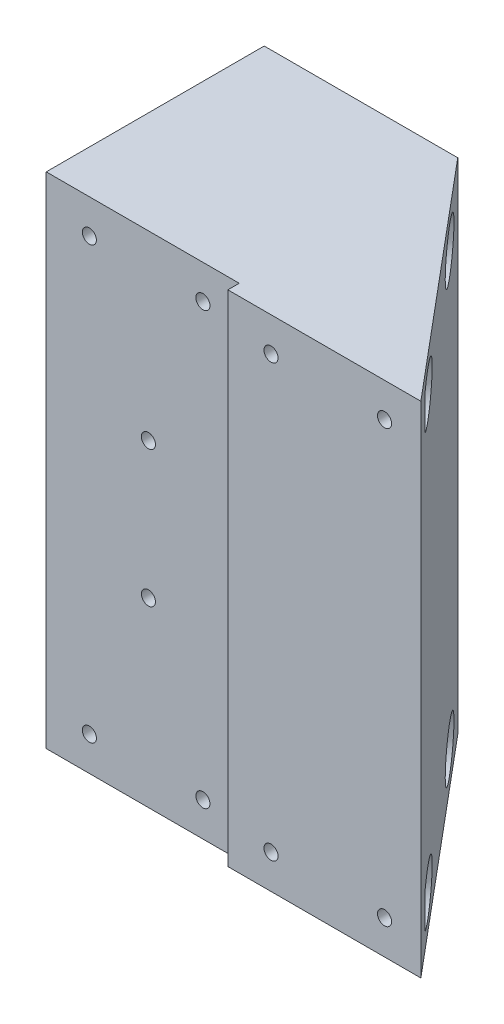
ISO-10303-21;
HEADER;
FILE_DESCRIPTION(('STEP AP214'),'2;1');
FILE_NAME('part.step','',(''),(''),'','','');
FILE_SCHEMA(('AUTOMOTIVE_DESIGN { 1 0 10303 214 1 1 1 1 }'));
ENDSEC;
DATA;
#1=APPLICATION_CONTEXT('core data for automotive mechanical design processes');
#2=APPLICATION_PROTOCOL_DEFINITION('international standard','automotive_design',2000,#1);
#3=PRODUCT_CONTEXT('',#1,'mechanical');
#4=PRODUCT('Part','Part','',(#3));
#5=PRODUCT_RELATED_PRODUCT_CATEGORY('part','',(#4));
#6=PRODUCT_DEFINITION_FORMATION('','',#4);
#7=PRODUCT_DEFINITION_CONTEXT('part definition',#1,'design');
#8=PRODUCT_DEFINITION('design','',#6,#7);
#9=PRODUCT_DEFINITION_SHAPE('','',#8);
#10=(LENGTH_UNIT() NAMED_UNIT(*) SI_UNIT(.MILLI.,.METRE.));
#11=(NAMED_UNIT(*) PLANE_ANGLE_UNIT() SI_UNIT($,.RADIAN.));
#12=(NAMED_UNIT(*) SI_UNIT($,.STERADIAN.) SOLID_ANGLE_UNIT());
#13=UNCERTAINTY_MEASURE_WITH_UNIT(LENGTH_MEASURE(1.E-05),#10,'distance_accuracy_value','');
#14=(GEOMETRIC_REPRESENTATION_CONTEXT(3) GLOBAL_UNCERTAINTY_ASSIGNED_CONTEXT((#13)) GLOBAL_UNIT_ASSIGNED_CONTEXT((#10,
#11,#12)) REPRESENTATION_CONTEXT('',''));
#15=CARTESIAN_POINT('',(0.,0.,0.));
#16=DIRECTION('',(0.,0.,1.));
#17=DIRECTION('',(1.,0.,0.));
#18=AXIS2_PLACEMENT_3D('',#15,#16,#17);
#19=CARTESIAN_POINT('',(-8.00000000000109,47.5000000000001,-0.001000000000001));
#20=DIRECTION('',(0.,0.,1.));
#21=DIRECTION('',(1.,0.,0.));
#22=AXIS2_PLACEMENT_3D('',#19,#20,#21);
#23=CYLINDRICAL_SURFACE('',#22,1.54999999999808);
#24=CARTESIAN_POINT('',(-8.00000000000109,47.5000000000001,48.));
#25=DIRECTION('',(0.,0.,1.));
#26=DIRECTION('',(1.,0.,0.));
#27=AXIS2_PLACEMENT_3D('',#24,#25,#26);
#28=CIRCLE('',#27,1.54999999999808);
#29=CARTESIAN_POINT('',(-6.45000000000301,47.5000000000001,48.));
#30=VERTEX_POINT('',#29);
#31=EDGE_CURVE('E236',#30,#30,#28,.T.);
#32=ORIENTED_EDGE('',*,*,#31,.T.);
#33=EDGE_LOOP('',(#32));
#34=FACE_BOUND('',#33,.T.);
#35=CARTESIAN_POINT('',(-8.00000000000109,47.5000000000001,40.));
#36=DIRECTION('',(0.,0.,-1.));
#37=DIRECTION('',(-1.,0.,0.));
#38=AXIS2_PLACEMENT_3D('',#35,#36,#37);
#39=CIRCLE('',#38,1.54999999999808);
#40=CARTESIAN_POINT('',(-9.54999999999917,47.5000000000001,40.));
#41=VERTEX_POINT('',#40);
#42=EDGE_CURVE('E43',#41,#41,#39,.F.);
#43=ORIENTED_EDGE('',*,*,#42,.F.);
#44=EDGE_LOOP('',(#43));
#45=FACE_BOUND('',#44,.T.);
#46=ADVANCED_FACE('F39',(#34,#45),#23,.F.);
#47=CARTESIAN_POINT('',(-33.0000000000001,-47.4999999999999,-0.001000000000001));
#48=DIRECTION('',(0.,0.,1.));
#49=DIRECTION('',(1.,0.,0.));
#50=AXIS2_PLACEMENT_3D('',#47,#48,#49);
#51=CYLINDRICAL_SURFACE('',#50,1.54999999999808);
#52=CARTESIAN_POINT('',(-33.0000000000001,-47.4999999999999,48.));
#53=DIRECTION('',(0.,0.,1.));
#54=DIRECTION('',(1.,0.,0.));
#55=AXIS2_PLACEMENT_3D('',#52,#53,#54);
#56=CIRCLE('',#55,1.54999999999808);
#57=CARTESIAN_POINT('',(-31.450000000002,-47.4999999999999,48.));
#58=VERTEX_POINT('',#57);
#59=EDGE_CURVE('E229',#58,#58,#56,.T.);
#60=ORIENTED_EDGE('',*,*,#59,.T.);
#61=EDGE_LOOP('',(#60));
#62=FACE_BOUND('',#61,.T.);
#63=CARTESIAN_POINT('',(-33.0000000000001,-47.4999999999999,40.));
#64=DIRECTION('',(0.,0.,-1.));
#65=DIRECTION('',(-1.,0.,0.));
#66=AXIS2_PLACEMENT_3D('',#63,#64,#65);
#67=CIRCLE('',#66,1.54999999999808);
#68=CARTESIAN_POINT('',(-34.5499999999982,-47.4999999999999,40.));
#69=VERTEX_POINT('',#68);
#70=EDGE_CURVE('E199',#69,#69,#67,.F.);
#71=ORIENTED_EDGE('',*,*,#70,.F.);
#72=EDGE_LOOP('',(#71));
#73=FACE_BOUND('',#72,.T.);
#74=ADVANCED_FACE('F288',(#62,#73),#51,.F.);
#75=CARTESIAN_POINT('',(-8.00000000000009,-47.4999999999999,-0.001000000000001));
#76=DIRECTION('',(0.,0.,1.));
#77=DIRECTION('',(1.,0.,0.));
#78=AXIS2_PLACEMENT_3D('',#75,#76,#77);
#79=CYLINDRICAL_SURFACE('',#78,1.54999999999808);
#80=CARTESIAN_POINT('',(-8.00000000000009,-47.4999999999999,48.));
#81=DIRECTION('',(0.,0.,1.));
#82=DIRECTION('',(1.,0.,0.));
#83=AXIS2_PLACEMENT_3D('',#80,#81,#82);
#84=CIRCLE('',#83,1.54999999999808);
#85=CARTESIAN_POINT('',(-6.45000000000201,-47.4999999999999,48.));
#86=VERTEX_POINT('',#85);
#87=EDGE_CURVE('E232',#86,#86,#84,.T.);
#88=ORIENTED_EDGE('',*,*,#87,.T.);
#89=EDGE_LOOP('',(#88));
#90=FACE_BOUND('',#89,.T.);
#91=CARTESIAN_POINT('',(-8.00000000000009,-47.4999999999999,40.));
#92=DIRECTION('',(0.,0.,-1.));
#93=DIRECTION('',(-1.,0.,0.));
#94=AXIS2_PLACEMENT_3D('',#91,#92,#93);
#95=CIRCLE('',#94,1.54999999999808);
#96=CARTESIAN_POINT('',(-9.54999999999817,-47.4999999999999,40.));
#97=VERTEX_POINT('',#96);
#98=EDGE_CURVE('E197',#97,#97,#95,.F.);
#99=ORIENTED_EDGE('',*,*,#98,.F.);
#100=EDGE_LOOP('',(#99));
#101=FACE_BOUND('',#100,.T.);
#102=ADVANCED_FACE('F294',(#90,#101),#79,.F.);
#103=CARTESIAN_POINT('',(-20.0000000000001,-14.9999999999999,-0.001000000000001));
#104=DIRECTION('',(0.,0.,1.));
#105=DIRECTION('',(1.,0.,0.));
#106=AXIS2_PLACEMENT_3D('',#103,#104,#105);
#107=CYLINDRICAL_SURFACE('',#106,1.54999999999809);
#108=CARTESIAN_POINT('',(-20.0000000000001,-14.9999999999999,48.));
#109=DIRECTION('',(0.,0.,1.));
#110=DIRECTION('',(1.,0.,0.));
#111=AXIS2_PLACEMENT_3D('',#108,#109,#110);
#112=CIRCLE('',#111,1.54999999999809);
#113=CARTESIAN_POINT('',(-18.450000000002,-14.9999999999999,48.));
#114=VERTEX_POINT('',#113);
#115=EDGE_CURVE('E240',#114,#114,#112,.T.);
#116=ORIENTED_EDGE('',*,*,#115,.T.);
#117=EDGE_LOOP('',(#116));
#118=FACE_BOUND('',#117,.T.);
#119=CARTESIAN_POINT('',(-20.0000000000001,-14.9999999999999,40.));
#120=DIRECTION('',(0.,0.,-1.));
#121=DIRECTION('',(-1.,0.,0.));
#122=AXIS2_PLACEMENT_3D('',#119,#120,#121);
#123=CIRCLE('',#122,1.54999999999809);
#124=CARTESIAN_POINT('',(-21.5499999999982,-14.9999999999999,40.));
#125=VERTEX_POINT('',#124);
#126=EDGE_CURVE('E194',#125,#125,#123,.F.);
#127=ORIENTED_EDGE('',*,*,#126,.F.);
#128=EDGE_LOOP('',(#127));
#129=FACE_BOUND('',#128,.T.);
#130=ADVANCED_FACE('F301',(#118,#129),#107,.F.);
#131=CARTESIAN_POINT('',(-20.0000000000004,15.0000000000001,-0.001000000000001));
#132=DIRECTION('',(0.,0.,1.));
#133=DIRECTION('',(1.,0.,0.));
#134=AXIS2_PLACEMENT_3D('',#131,#132,#133);
#135=CYLINDRICAL_SURFACE('',#134,1.54999999999809);
#136=CARTESIAN_POINT('',(-20.0000000000004,15.0000000000001,48.));
#137=DIRECTION('',(0.,0.,1.));
#138=DIRECTION('',(1.,0.,0.));
#139=AXIS2_PLACEMENT_3D('',#136,#137,#138);
#140=CIRCLE('',#139,1.54999999999809);
#141=CARTESIAN_POINT('',(-18.4500000000023,15.0000000000001,48.));
#142=VERTEX_POINT('',#141);
#143=EDGE_CURVE('E237',#142,#142,#140,.T.);
#144=ORIENTED_EDGE('',*,*,#143,.T.);
#145=EDGE_LOOP('',(#144));
#146=FACE_BOUND('',#145,.T.);
#147=CARTESIAN_POINT('',(-20.0000000000004,15.0000000000001,40.));
#148=DIRECTION('',(0.,0.,-1.));
#149=DIRECTION('',(-1.,0.,0.));
#150=AXIS2_PLACEMENT_3D('',#147,#148,#149);
#151=CIRCLE('',#150,1.54999999999809);
#152=CARTESIAN_POINT('',(-21.5499999999985,15.0000000000001,40.));
#153=VERTEX_POINT('',#152);
#154=EDGE_CURVE('E190',#153,#153,#151,.F.);
#155=ORIENTED_EDGE('',*,*,#154,.F.);
#156=EDGE_LOOP('',(#155));
#157=FACE_BOUND('',#156,.T.);
#158=ADVANCED_FACE('F305',(#146,#157),#135,.F.);
#159=CARTESIAN_POINT('',(-33.0000000000011,47.5000000000001,-0.001000000000001));
#160=DIRECTION('',(0.,0.,1.));
#161=DIRECTION('',(1.,0.,0.));
#162=AXIS2_PLACEMENT_3D('',#159,#160,#161);
#163=CYLINDRICAL_SURFACE('',#162,1.54999999999808);
#164=CARTESIAN_POINT('',(-33.0000000000011,47.5000000000001,48.));
#165=DIRECTION('',(0.,0.,1.));
#166=DIRECTION('',(1.,0.,0.));
#167=AXIS2_PLACEMENT_3D('',#164,#165,#166);
#168=CIRCLE('',#167,1.54999999999808);
#169=CARTESIAN_POINT('',(-31.450000000003,47.5000000000001,48.));
#170=VERTEX_POINT('',#169);
#171=EDGE_CURVE('E233',#170,#170,#168,.T.);
#172=ORIENTED_EDGE('',*,*,#171,.T.);
#173=EDGE_LOOP('',(#172));
#174=FACE_BOUND('',#173,.T.);
#175=CARTESIAN_POINT('',(-33.0000000000011,47.5000000000001,40.));
#176=DIRECTION('',(0.,0.,-1.));
#177=DIRECTION('',(-1.,0.,0.));
#178=AXIS2_PLACEMENT_3D('',#175,#176,#177);
#179=CIRCLE('',#178,1.54999999999808);
#180=CARTESIAN_POINT('',(-34.5499999999992,47.5000000000001,40.));
#181=VERTEX_POINT('',#180);
#182=EDGE_CURVE('E187',#181,#181,#179,.F.);
#183=ORIENTED_EDGE('',*,*,#182,.F.);
#184=EDGE_LOOP('',(#183));
#185=FACE_BOUND('',#184,.T.);
#186=ADVANCED_FACE('F309',(#174,#185),#163,.F.);
#187=CARTESIAN_POINT('',(9.50000000000001,47.5,0.));
#188=DIRECTION('',(0.,0.,1.));
#189=DIRECTION('',(1.,0.,0.));
#190=AXIS2_PLACEMENT_3D('',#187,#188,#189);
#191=CYLINDRICAL_SURFACE('',#190,1.55);
#192=CARTESIAN_POINT('',(9.50000000000001,47.5,50.5));
#193=DIRECTION('',(0.,0.,1.));
#194=DIRECTION('',(1.,0.,0.));
#195=AXIS2_PLACEMENT_3D('',#192,#193,#194);
#196=CIRCLE('',#195,1.55);
#197=CARTESIAN_POINT('',(11.05,47.5,50.5));
#198=VERTEX_POINT('',#197);
#199=EDGE_CURVE('E221',#198,#198,#196,.T.);
#200=ORIENTED_EDGE('',*,*,#199,.T.);
#201=EDGE_LOOP('',(#200));
#202=FACE_BOUND('',#201,.T.);
#203=CARTESIAN_POINT('',(9.50000000000001,47.5,45.));
#204=DIRECTION('',(0.,0.,-1.));
#205=DIRECTION('',(-1.,0.,0.));
#206=AXIS2_PLACEMENT_3D('',#203,#204,#205);
#207=CIRCLE('',#206,1.55);
#208=CARTESIAN_POINT('',(7.95000000000001,47.5,45.));
#209=VERTEX_POINT('',#208);
#210=EDGE_CURVE('E178',#209,#209,#207,.F.);
#211=ORIENTED_EDGE('',*,*,#210,.F.);
#212=EDGE_LOOP('',(#211));
#213=FACE_BOUND('',#212,.T.);
#214=ADVANCED_FACE('F312',(#202,#213),#191,.F.);
#215=CARTESIAN_POINT('',(34.5,47.5,0.));
#216=DIRECTION('',(0.,0.,1.));
#217=DIRECTION('',(1.,0.,0.));
#218=AXIS2_PLACEMENT_3D('',#215,#216,#217);
#219=CYLINDRICAL_SURFACE('',#218,1.55);
#220=CARTESIAN_POINT('',(34.5,47.5,50.5));
#221=DIRECTION('',(0.,0.,1.));
#222=DIRECTION('',(1.,0.,0.));
#223=AXIS2_PLACEMENT_3D('',#220,#221,#222);
#224=CIRCLE('',#223,1.55);
#225=CARTESIAN_POINT('',(36.05,47.5,50.5));
#226=VERTEX_POINT('',#225);
#227=EDGE_CURVE('E218',#226,#226,#224,.T.);
#228=ORIENTED_EDGE('',*,*,#227,.T.);
#229=EDGE_LOOP('',(#228));
#230=FACE_BOUND('',#229,.T.);
#231=CARTESIAN_POINT('',(34.5,47.5,45.));
#232=DIRECTION('',(0.,0.,-1.));
#233=DIRECTION('',(-1.,0.,0.));
#234=AXIS2_PLACEMENT_3D('',#231,#232,#233);
#235=CIRCLE('',#234,1.55);
#236=CARTESIAN_POINT('',(32.95,47.5,45.));
#237=VERTEX_POINT('',#236);
#238=EDGE_CURVE('E107',#237,#237,#235,.F.);
#239=ORIENTED_EDGE('',*,*,#238,.F.);
#240=EDGE_LOOP('',(#239));
#241=FACE_BOUND('',#240,.T.);
#242=ADVANCED_FACE('F317',(#230,#241),#219,.F.);
#243=CARTESIAN_POINT('',(34.500000000001,-47.5,0.));
#244=DIRECTION('',(0.,0.,1.));
#245=DIRECTION('',(1.,0.,0.));
#246=AXIS2_PLACEMENT_3D('',#243,#244,#245);
#247=CYLINDRICAL_SURFACE('',#246,1.54999999999999);
#248=CARTESIAN_POINT('',(34.500000000001,-47.5,50.5));
#249=DIRECTION('',(0.,0.,1.));
#250=DIRECTION('',(1.,0.,0.));
#251=AXIS2_PLACEMENT_3D('',#248,#249,#250);
#252=CIRCLE('',#251,1.54999999999999);
#253=CARTESIAN_POINT('',(36.050000000001,-47.5,50.5));
#254=VERTEX_POINT('',#253);
#255=EDGE_CURVE('E222',#254,#254,#252,.T.);
#256=ORIENTED_EDGE('',*,*,#255,.T.);
#257=EDGE_LOOP('',(#256));
#258=FACE_BOUND('',#257,.T.);
#259=CARTESIAN_POINT('',(34.500000000001,-47.5,45.));
#260=DIRECTION('',(0.,0.,-1.));
#261=DIRECTION('',(-1.,0.,0.));
#262=AXIS2_PLACEMENT_3D('',#259,#260,#261);
#263=CIRCLE('',#262,1.54999999999999);
#264=CARTESIAN_POINT('',(32.950000000001,-47.5,45.));
#265=VERTEX_POINT('',#264);
#266=EDGE_CURVE('E108',#265,#265,#263,.F.);
#267=ORIENTED_EDGE('',*,*,#266,.F.);
#268=EDGE_LOOP('',(#267));
#269=FACE_BOUND('',#268,.T.);
#270=ADVANCED_FACE('F322',(#258,#269),#247,.F.);
#271=CARTESIAN_POINT('',(9.50000000000099,-47.5,0.));
#272=DIRECTION('',(0.,0.,1.));
#273=DIRECTION('',(1.,0.,0.));
#274=AXIS2_PLACEMENT_3D('',#271,#272,#273);
#275=CYLINDRICAL_SURFACE('',#274,1.55);
#276=CARTESIAN_POINT('',(9.50000000000099,-47.5,50.5));
#277=DIRECTION('',(0.,0.,1.));
#278=DIRECTION('',(1.,0.,0.));
#279=AXIS2_PLACEMENT_3D('',#276,#277,#278);
#280=CIRCLE('',#279,1.55);
#281=CARTESIAN_POINT('',(11.050000000001,-47.5,50.5));
#282=VERTEX_POINT('',#281);
#283=EDGE_CURVE('E186',#282,#282,#280,.T.);
#284=ORIENTED_EDGE('',*,*,#283,.T.);
#285=EDGE_LOOP('',(#284));
#286=FACE_BOUND('',#285,.T.);
#287=CARTESIAN_POINT('',(9.50000000000099,-47.5,45.));
#288=DIRECTION('',(0.,0.,-1.));
#289=DIRECTION('',(-1.,0.,0.));
#290=AXIS2_PLACEMENT_3D('',#287,#288,#289);
#291=CIRCLE('',#290,1.55);
#292=CARTESIAN_POINT('',(7.95000000000099,-47.5,45.));
#293=VERTEX_POINT('',#292);
#294=EDGE_CURVE('E171',#293,#293,#291,.F.);
#295=ORIENTED_EDGE('',*,*,#294,.F.);
#296=EDGE_LOOP('',(#295));
#297=FACE_BOUND('',#296,.T.);
#298=ADVANCED_FACE('F319',(#286,#297),#275,.F.);
#299=CARTESIAN_POINT('',(-42.5,-55.,50.5));
#300=DIRECTION('',(1.,0.,0.));
#301=DIRECTION('',(0.,0.,-1.));
#302=AXIS2_PLACEMENT_3D('',#299,#300,#301);
#303=PLANE('',#302);
#304=DIRECTION('',(0.,-1.,0.));
#305=VECTOR('',#304,1.);
#306=CARTESIAN_POINT('',(-42.5,55.,48.));
#307=LINE('',#306,#305);
#308=CARTESIAN_POINT('',(-42.5,55.,48.));
#309=VERTEX_POINT('',#308);
#310=CARTESIAN_POINT('',(-42.5,-55.,48.));
#311=VERTEX_POINT('',#310);
#312=EDGE_CURVE('E249',#309,#311,#307,.T.);
#313=ORIENTED_EDGE('',*,*,#312,.F.);
#314=DIRECTION('',(0.,0.,-1.));
#315=VECTOR('',#314,1.);
#316=CARTESIAN_POINT('',(-42.5,55.,50.5));
#317=LINE('',#316,#315);
#318=CARTESIAN_POINT('',(-42.5,55.,0.));
#319=VERTEX_POINT('',#318);
#320=EDGE_CURVE('E158',#309,#319,#317,.T.);
#321=ORIENTED_EDGE('',*,*,#320,.T.);
#322=DIRECTION('',(0.,-1.,0.));
#323=VECTOR('',#322,1.);
#324=CARTESIAN_POINT('',(-42.5,-55.,0.));
#325=LINE('',#324,#323);
#326=CARTESIAN_POINT('',(-42.5,-55.,0.));
#327=VERTEX_POINT('',#326);
#328=EDGE_CURVE('E164',#319,#327,#325,.T.);
#329=ORIENTED_EDGE('',*,*,#328,.T.);
#330=DIRECTION('',(0.,0.,-1.));
#331=VECTOR('',#330,1.);
#332=CARTESIAN_POINT('',(-42.5,-55.,50.5));
#333=LINE('',#332,#331);
#334=EDGE_CURVE('E156',#311,#327,#333,.T.);
#335=ORIENTED_EDGE('',*,*,#334,.F.);
#336=EDGE_LOOP('',(#313,#321,#329,#335));
#337=FACE_BOUND('',#336,.T.);
#338=ADVANCED_FACE('F270',(#337),#303,.F.);
#339=CARTESIAN_POINT('',(-42.5,55.,50.5));
#340=DIRECTION('',(0.,-1.,0.));
#341=DIRECTION('',(0.,0.,-1.));
#342=AXIS2_PLACEMENT_3D('',#339,#340,#341);
#343=PLANE('',#342);
#344=DIRECTION('',(-1.,0.,0.));
#345=VECTOR('',#344,1.);
#346=CARTESIAN_POINT('',(-42.5,55.,50.5));
#347=LINE('',#346,#345);
#348=CARTESIAN_POINT('',(42.5,55.,50.5));
#349=VERTEX_POINT('',#348);
#350=CARTESIAN_POINT('',(0.,55.,50.5));
#351=VERTEX_POINT('',#350);
#352=EDGE_CURVE('E141',#349,#351,#347,.T.);
#353=ORIENTED_EDGE('',*,*,#352,.F.);
#354=DIRECTION('',(0.642787609686538,0.,0.766044443118979));
#355=VECTOR('',#354,1.);
#356=CARTESIAN_POINT('',(0.0736280118641227,55.,-0.0617812375995015));
#357=LINE('',#356,#355);
#358=CARTESIAN_POINT('',(0.125468625547541,55.,0.));
#359=VERTEX_POINT('',#358);
#360=EDGE_CURVE('E136',#359,#349,#357,.T.);
#361=ORIENTED_EDGE('',*,*,#360,.F.);
#362=DIRECTION('',(-1.,0.,0.));
#363=VECTOR('',#362,1.);
#364=CARTESIAN_POINT('',(-42.5,55.,0.));
#365=LINE('',#364,#363);
#366=EDGE_CURVE('E162',#359,#319,#365,.T.);
#367=ORIENTED_EDGE('',*,*,#366,.T.);
#368=ORIENTED_EDGE('',*,*,#320,.F.);
#369=DIRECTION('',(-1.,0.,0.));
#370=VECTOR('',#369,1.);
#371=CARTESIAN_POINT('',(-42.5,55.,48.));
#372=LINE('',#371,#370);
#373=CARTESIAN_POINT('',(0.,55.,48.));
#374=VERTEX_POINT('',#373);
#375=EDGE_CURVE('E257',#374,#309,#372,.T.);
#376=ORIENTED_EDGE('',*,*,#375,.F.);
#377=DIRECTION('',(0.,0.,1.));
#378=VECTOR('',#377,1.);
#379=CARTESIAN_POINT('',(0.,55.,48.));
#380=LINE('',#379,#378);
#381=EDGE_CURVE('E165',#374,#351,#380,.T.);
#382=ORIENTED_EDGE('',*,*,#381,.T.);
#383=EDGE_LOOP('',(#353,#361,#367,#368,#376,#382));
#384=FACE_BOUND('',#383,.T.);
#385=ADVANCED_FACE('F41',(#384),#343,.F.);
#386=CARTESIAN_POINT('',(-42.5,-55.,50.5));
#387=DIRECTION('',(0.,1.,0.));
#388=DIRECTION('',(0.,0.,1.));
#389=AXIS2_PLACEMENT_3D('',#386,#387,#388);
#390=PLANE('',#389);
#391=DIRECTION('',(1.,0.,0.));
#392=VECTOR('',#391,1.);
#393=CARTESIAN_POINT('',(-42.5,-55.,0.));
#394=LINE('',#393,#392);
#395=CARTESIAN_POINT('',(0.125468625547541,-55.,0.));
#396=VERTEX_POINT('',#395);
#397=EDGE_CURVE('E142',#327,#396,#394,.T.);
#398=ORIENTED_EDGE('',*,*,#397,.T.);
#399=DIRECTION('',(-0.642787609686538,0.,-0.766044443118979));
#400=VECTOR('',#399,1.);
#401=CARTESIAN_POINT('',(0.0736280118641227,-55.,-0.0617812375995015));
#402=LINE('',#401,#400);
#403=CARTESIAN_POINT('',(42.5,-55.,50.5));
#404=VERTEX_POINT('',#403);
#405=EDGE_CURVE('E133',#404,#396,#402,.T.);
#406=ORIENTED_EDGE('',*,*,#405,.F.);
#407=DIRECTION('',(1.,0.,0.));
#408=VECTOR('',#407,1.);
#409=CARTESIAN_POINT('',(-42.5,-55.,50.5));
#410=LINE('',#409,#408);
#411=CARTESIAN_POINT('',(0.,-55.,50.5));
#412=VERTEX_POINT('',#411);
#413=EDGE_CURVE('E149',#412,#404,#410,.T.);
#414=ORIENTED_EDGE('',*,*,#413,.F.);
#415=DIRECTION('',(0.,0.,1.));
#416=VECTOR('',#415,1.);
#417=CARTESIAN_POINT('',(0.,-55.,48.));
#418=LINE('',#417,#416);
#419=CARTESIAN_POINT('',(0.,-55.,48.));
#420=VERTEX_POINT('',#419);
#421=EDGE_CURVE('E259',#420,#412,#418,.T.);
#422=ORIENTED_EDGE('',*,*,#421,.F.);
#423=DIRECTION('',(1.,0.,0.));
#424=VECTOR('',#423,1.);
#425=CARTESIAN_POINT('',(-42.5,-55.,48.));
#426=LINE('',#425,#424);
#427=EDGE_CURVE('E251',#311,#420,#426,.T.);
#428=ORIENTED_EDGE('',*,*,#427,.F.);
#429=ORIENTED_EDGE('',*,*,#334,.T.);
#430=EDGE_LOOP('',(#398,#406,#414,#422,#428,#429));
#431=FACE_BOUND('',#430,.T.);
#432=ADVANCED_FACE('F147',(#431),#390,.F.);
#433=CARTESIAN_POINT('',(0.,0.,50.5));
#434=DIRECTION('',(0.,0.,-1.));
#435=DIRECTION('',(-1.,0.,0.));
#436=AXIS2_PLACEMENT_3D('',#433,#434,#435);
#437=PLANE('',#436);
#438=ORIENTED_EDGE('',*,*,#283,.F.);
#439=EDGE_LOOP('',(#438));
#440=FACE_BOUND('',#439,.T.);
#441=ORIENTED_EDGE('',*,*,#255,.F.);
#442=EDGE_LOOP('',(#441));
#443=FACE_BOUND('',#442,.T.);
#444=ORIENTED_EDGE('',*,*,#227,.F.);
#445=EDGE_LOOP('',(#444));
#446=FACE_BOUND('',#445,.T.);
#447=ORIENTED_EDGE('',*,*,#199,.F.);
#448=EDGE_LOOP('',(#447));
#449=FACE_BOUND('',#448,.T.);
#450=ORIENTED_EDGE('',*,*,#352,.T.);
#451=DIRECTION('',(0.,1.,0.));
#452=VECTOR('',#451,1.);
#453=CARTESIAN_POINT('',(0.,55.,50.5));
#454=LINE('',#453,#452);
#455=EDGE_CURVE('E155',#412,#351,#454,.T.);
#456=ORIENTED_EDGE('',*,*,#455,.F.);
#457=ORIENTED_EDGE('',*,*,#413,.T.);
#458=DIRECTION('',(0.,1.,0.));
#459=VECTOR('',#458,1.);
#460=CARTESIAN_POINT('',(42.5,-55.,50.5));
#461=LINE('',#460,#459);
#462=EDGE_CURVE('E131',#404,#349,#461,.T.);
#463=ORIENTED_EDGE('',*,*,#462,.T.);
#464=EDGE_LOOP('',(#450,#456,#457,#463));
#465=FACE_BOUND('',#464,.T.);
#466=ADVANCED_FACE('F154',(#440,#443,#446,#449,#465),#437,.F.);
#467=CARTESIAN_POINT('',(0.,0.,0.));
#468=DIRECTION('',(0.,0.,-1.));
#469=DIRECTION('',(-1.,0.,0.));
#470=AXIS2_PLACEMENT_3D('',#467,#468,#469);
#471=PLANE('',#470);
#472=CARTESIAN_POINT('',(-33.0000000000011,47.5000000000001,0.));
#473=DIRECTION('',(0.,0.,-1.));
#474=DIRECTION('',(-1.,0.,0.));
#475=AXIS2_PLACEMENT_3D('',#472,#473,#474);
#476=CIRCLE('',#475,5.00000000000164);
#477=CARTESIAN_POINT('',(-38.0000000000027,47.5000000000001,0.));
#478=VERTEX_POINT('',#477);
#479=EDGE_CURVE('E424',#478,#478,#476,.T.);
#480=ORIENTED_EDGE('',*,*,#479,.F.);
#481=EDGE_LOOP('',(#480));
#482=FACE_BOUND('',#481,.T.);
#483=CARTESIAN_POINT('',(-33.0000000000001,-47.4999999999999,0.));
#484=DIRECTION('',(0.,0.,-1.));
#485=DIRECTION('',(-1.,0.,0.));
#486=AXIS2_PLACEMENT_3D('',#483,#484,#485);
#487=CIRCLE('',#486,5.00000000000164);
#488=CARTESIAN_POINT('',(-38.0000000000017,-47.4999999999999,0.));
#489=VERTEX_POINT('',#488);
#490=EDGE_CURVE('E430',#489,#489,#487,.T.);
#491=ORIENTED_EDGE('',*,*,#490,.F.);
#492=EDGE_LOOP('',(#491));
#493=FACE_BOUND('',#492,.T.);
#494=CARTESIAN_POINT('',(-8.00000000000009,-47.4999999999999,0.));
#495=DIRECTION('',(0.,0.,-1.));
#496=DIRECTION('',(-1.,0.,0.));
#497=AXIS2_PLACEMENT_3D('',#494,#495,#496);
#498=CIRCLE('',#497,5.00000000000164);
#499=CARTESIAN_POINT('',(-13.0000000000017,-47.4999999999999,0.));
#500=VERTEX_POINT('',#499);
#501=EDGE_CURVE('E436',#500,#500,#498,.T.);
#502=ORIENTED_EDGE('',*,*,#501,.F.);
#503=EDGE_LOOP('',(#502));
#504=FACE_BOUND('',#503,.T.);
#505=CARTESIAN_POINT('',(-20.0000000000004,15.0000000000001,0.));
#506=DIRECTION('',(0.,0.,-1.));
#507=DIRECTION('',(-1.,0.,0.));
#508=AXIS2_PLACEMENT_3D('',#505,#506,#507);
#509=CIRCLE('',#508,5.00000000000165);
#510=CARTESIAN_POINT('',(-25.000000000002,15.0000000000001,0.));
#511=VERTEX_POINT('',#510);
#512=EDGE_CURVE('E412',#511,#511,#509,.T.);
#513=ORIENTED_EDGE('',*,*,#512,.F.);
#514=EDGE_LOOP('',(#513));
#515=FACE_BOUND('',#514,.T.);
#516=CARTESIAN_POINT('',(-20.0000000000001,-14.9999999999999,0.));
#517=DIRECTION('',(0.,0.,-1.));
#518=DIRECTION('',(-1.,0.,0.));
#519=AXIS2_PLACEMENT_3D('',#516,#517,#518);
#520=CIRCLE('',#519,5.00000000000165);
#521=CARTESIAN_POINT('',(-25.0000000000017,-14.9999999999999,0.));
#522=VERTEX_POINT('',#521);
#523=EDGE_CURVE('E413',#522,#522,#520,.T.);
#524=ORIENTED_EDGE('',*,*,#523,.F.);
#525=EDGE_LOOP('',(#524));
#526=FACE_BOUND('',#525,.T.);
#527=CARTESIAN_POINT('',(-8.00000000000109,47.5000000000001,0.));
#528=DIRECTION('',(0.,0.,-1.));
#529=DIRECTION('',(-1.,0.,0.));
#530=AXIS2_PLACEMENT_3D('',#527,#528,#529);
#531=CIRCLE('',#530,5.00000000000164);
#532=CARTESIAN_POINT('',(-13.0000000000027,47.5000000000001,0.));
#533=VERTEX_POINT('',#532);
#534=EDGE_CURVE('E212',#533,#533,#531,.T.);
#535=ORIENTED_EDGE('',*,*,#534,.F.);
#536=EDGE_LOOP('',(#535));
#537=FACE_BOUND('',#536,.T.);
#538=DIRECTION('',(0.,-1.,0.));
#539=VECTOR('',#538,1.);
#540=CARTESIAN_POINT('',(0.12546862554754,0.,0.));
#541=LINE('',#540,#539);
#542=EDGE_CURVE('E151',#359,#396,#541,.T.);
#543=ORIENTED_EDGE('',*,*,#542,.T.);
#544=ORIENTED_EDGE('',*,*,#397,.F.);
#545=ORIENTED_EDGE('',*,*,#328,.F.);
#546=ORIENTED_EDGE('',*,*,#366,.F.);
#547=EDGE_LOOP('',(#543,#544,#545,#546));
#548=FACE_BOUND('',#547,.T.);
#549=ADVANCED_FACE('F275',(#482,#493,#504,#515,#526,#537,#548),#471,.T.);
#550=CARTESIAN_POINT('',(0.,55.,48.));
#551=DIRECTION('',(1.,0.,0.));
#552=DIRECTION('',(0.,0.,-1.));
#553=AXIS2_PLACEMENT_3D('',#550,#551,#552);
#554=PLANE('',#553);
#555=ORIENTED_EDGE('',*,*,#455,.T.);
#556=ORIENTED_EDGE('',*,*,#381,.F.);
#557=DIRECTION('',(0.,1.,0.));
#558=VECTOR('',#557,1.);
#559=CARTESIAN_POINT('',(0.,55.,48.));
#560=LINE('',#559,#558);
#561=EDGE_CURVE('E254',#420,#374,#560,.T.);
#562=ORIENTED_EDGE('',*,*,#561,.F.);
#563=ORIENTED_EDGE('',*,*,#421,.T.);
#564=EDGE_LOOP('',(#555,#556,#562,#563));
#565=FACE_BOUND('',#564,.T.);
#566=ADVANCED_FACE('F264',(#565),#554,.F.);
#567=CARTESIAN_POINT('',(0.,0.,48.));
#568=DIRECTION('',(0.,0.,1.));
#569=DIRECTION('',(1.,0.,0.));
#570=AXIS2_PLACEMENT_3D('',#567,#568,#569);
#571=PLANE('',#570);
#572=ORIENTED_EDGE('',*,*,#171,.F.);
#573=EDGE_LOOP('',(#572));
#574=FACE_BOUND('',#573,.T.);
#575=ORIENTED_EDGE('',*,*,#143,.F.);
#576=EDGE_LOOP('',(#575));
#577=FACE_BOUND('',#576,.T.);
#578=ORIENTED_EDGE('',*,*,#115,.F.);
#579=EDGE_LOOP('',(#578));
#580=FACE_BOUND('',#579,.T.);
#581=ORIENTED_EDGE('',*,*,#87,.F.);
#582=EDGE_LOOP('',(#581));
#583=FACE_BOUND('',#582,.T.);
#584=ORIENTED_EDGE('',*,*,#59,.F.);
#585=EDGE_LOOP('',(#584));
#586=FACE_BOUND('',#585,.T.);
#587=ORIENTED_EDGE('',*,*,#31,.F.);
#588=EDGE_LOOP('',(#587));
#589=FACE_BOUND('',#588,.T.);
#590=ORIENTED_EDGE('',*,*,#312,.T.);
#591=ORIENTED_EDGE('',*,*,#427,.T.);
#592=ORIENTED_EDGE('',*,*,#561,.T.);
#593=ORIENTED_EDGE('',*,*,#375,.T.);
#594=EDGE_LOOP('',(#590,#591,#592,#593));
#595=FACE_BOUND('',#594,.T.);
#596=ADVANCED_FACE('F119',(#574,#577,#580,#583,#586,#589,#595),#571,.T.);
#597=CARTESIAN_POINT('',(0.0736280118641227,0.,-0.0617812375995015));
#598=DIRECTION('',(-0.766044443118979,0.,0.642787609686538));
#599=DIRECTION('',(0.642787609686538,0.,0.766044443118979));
#600=AXIS2_PLACEMENT_3D('',#597,#598,#599);
#601=PLANE('',#600);
#602=CARTESIAN_POINT('',(9.50000000000001,47.5,11.1721314443909));
#603=DIRECTION('',(-0.766044443118979,0.,0.642787609686538));
#604=DIRECTION('',(-0.642787609686538,0.,-0.766044443118979));
#605=AXIS2_PLACEMENT_3D('',#602,#603,#604);
#606=ELLIPSE('',#605,7.77861913430208,5.);
#607=CARTESIAN_POINT('',(4.50000000000001,47.5,5.21336348141984));
#608=VERTEX_POINT('',#607);
#609=EDGE_CURVE('E182',#608,#608,#606,.T.);
#610=ORIENTED_EDGE('',*,*,#609,.T.);
#611=EDGE_LOOP('',(#610));
#612=FACE_BOUND('',#611,.T.);
#613=DIRECTION('',(0.,-1.,0.));
#614=VECTOR('',#613,1.);
#615=CARTESIAN_POINT('',(37.884952028525,0.,45.));
#616=LINE('',#615,#614);
#617=CARTESIAN_POINT('',(37.884952028525,-43.8200407930805,45.));
#618=VERTEX_POINT('',#617);
#619=CARTESIAN_POINT('',(37.884952028525,-51.1799592069195,45.));
#620=VERTEX_POINT('',#619);
#621=EDGE_CURVE('E104',#618,#620,#616,.T.);
#622=ORIENTED_EDGE('',*,*,#621,.F.);
#623=CARTESIAN_POINT('',(34.500000000001,-47.5,40.9659712592475));
#624=DIRECTION('',(-0.766044443118979,0.,0.642787609686538));
#625=DIRECTION('',(-0.642787609686538,0.,-0.766044443118979));
#626=AXIS2_PLACEMENT_3D('',#623,#624,#625);
#627=ELLIPSE('',#626,7.77861913430208,5.);
#628=EDGE_CURVE('E12',#618,#620,#627,.T.);
#629=ORIENTED_EDGE('',*,*,#628,.T.);
#630=EDGE_LOOP('',(#622,#629));
#631=FACE_BOUND('',#630,.T.);
#632=CARTESIAN_POINT('',(9.50000000000099,-47.5,11.1721314443921));
#633=DIRECTION('',(-0.766044443118979,0.,0.642787609686538));
#634=DIRECTION('',(-0.642787609686538,0.,-0.766044443118979));
#635=AXIS2_PLACEMENT_3D('',#632,#633,#634);
#636=ELLIPSE('',#635,7.77861913430208,5.);
#637=CARTESIAN_POINT('',(4.500000000001,-47.5,5.21336348142101));
#638=VERTEX_POINT('',#637);
#639=EDGE_CURVE('E125',#638,#638,#636,.T.);
#640=ORIENTED_EDGE('',*,*,#639,.T.);
#641=EDGE_LOOP('',(#640));
#642=FACE_BOUND('',#641,.T.);
#643=DIRECTION('',(0.,-1.,0.));
#644=VECTOR('',#643,1.);
#645=CARTESIAN_POINT('',(37.884952028525,0.,45.));
#646=LINE('',#645,#644);
#647=CARTESIAN_POINT('',(37.884952028525,51.1799592069186,45.));
#648=VERTEX_POINT('',#647);
#649=CARTESIAN_POINT('',(37.884952028525,43.8200407930814,45.));
#650=VERTEX_POINT('',#649);
#651=EDGE_CURVE('E129',#648,#650,#646,.T.);
#652=ORIENTED_EDGE('',*,*,#651,.F.);
#653=CARTESIAN_POINT('',(34.5,47.5,40.9659712592463));
#654=DIRECTION('',(-0.766044443118979,0.,0.642787609686538));
#655=DIRECTION('',(-0.642787609686538,0.,-0.766044443118979));
#656=AXIS2_PLACEMENT_3D('',#653,#654,#655);
#657=ELLIPSE('',#656,7.77861913430208,5.);
#658=EDGE_CURVE('E48',#648,#650,#657,.T.);
#659=ORIENTED_EDGE('',*,*,#658,.T.);
#660=EDGE_LOOP('',(#652,#659));
#661=FACE_BOUND('',#660,.T.);
#662=ORIENTED_EDGE('',*,*,#462,.F.);
#663=ORIENTED_EDGE('',*,*,#405,.T.);
#664=ORIENTED_EDGE('',*,*,#542,.F.);
#665=ORIENTED_EDGE('',*,*,#360,.T.);
#666=EDGE_LOOP('',(#662,#663,#664,#665));
#667=FACE_BOUND('',#666,.T.);
#668=ADVANCED_FACE('F115',(#612,#631,#642,#661,#667),#601,.F.);
#669=CARTESIAN_POINT('',(9.50000000000099,-47.5,45.));
#670=DIRECTION('',(0.,0.,-1.));
#671=DIRECTION('',(-1.,0.,0.));
#672=AXIS2_PLACEMENT_3D('',#669,#670,#671);
#673=CYLINDRICAL_SURFACE('',#672,5.);
#674=CARTESIAN_POINT('',(9.50000000000099,-47.5,45.));
#675=DIRECTION('',(0.,0.,-1.));
#676=DIRECTION('',(-1.,0.,0.));
#677=AXIS2_PLACEMENT_3D('',#674,#675,#676);
#678=CIRCLE('',#677,5.);
#679=CARTESIAN_POINT('',(4.500000000001,-47.5,45.));
#680=VERTEX_POINT('',#679);
#681=EDGE_CURVE('E113',#680,#680,#678,.T.);
#682=ORIENTED_EDGE('',*,*,#681,.F.);
#683=EDGE_LOOP('',(#682));
#684=FACE_BOUND('',#683,.T.);
#685=ORIENTED_EDGE('',*,*,#639,.F.);
#686=EDGE_LOOP('',(#685));
#687=FACE_BOUND('',#686,.T.);
#688=ADVANCED_FACE('F118',(#684,#687),#673,.F.);
#689=CARTESIAN_POINT('',(9.50000000000099,-47.5,45.));
#690=DIRECTION('',(0.,0.,-1.));
#691=DIRECTION('',(-1.,0.,0.));
#692=AXIS2_PLACEMENT_3D('',#689,#690,#691);
#693=PLANE('',#692);
#694=ORIENTED_EDGE('',*,*,#681,.T.);
#695=EDGE_LOOP('',(#694));
#696=FACE_BOUND('',#695,.T.);
#697=ORIENTED_EDGE('',*,*,#294,.T.);
#698=EDGE_LOOP('',(#697));
#699=FACE_BOUND('',#698,.T.);
#700=ADVANCED_FACE('F341',(#696,#699),#693,.T.);
#701=CARTESIAN_POINT('',(34.500000000001,-47.5,45.));
#702=DIRECTION('',(0.,0.,-1.));
#703=DIRECTION('',(-1.,0.,0.));
#704=AXIS2_PLACEMENT_3D('',#701,#702,#703);
#705=CYLINDRICAL_SURFACE('',#704,5.);
#706=CARTESIAN_POINT('',(34.500000000001,-47.5,45.));
#707=DIRECTION('',(0.,0.,-1.));
#708=DIRECTION('',(-1.,0.,0.));
#709=AXIS2_PLACEMENT_3D('',#706,#707,#708);
#710=CIRCLE('',#709,5.);
#711=EDGE_CURVE('E55',#620,#618,#710,.T.);
#712=ORIENTED_EDGE('',*,*,#711,.F.);
#713=ORIENTED_EDGE('',*,*,#628,.F.);
#714=EDGE_LOOP('',(#712,#713));
#715=FACE_BOUND('',#714,.T.);
#716=ADVANCED_FACE('F111',(#715),#705,.F.);
#717=CARTESIAN_POINT('',(34.500000000001,-47.5,45.));
#718=DIRECTION('',(0.,0.,-1.));
#719=DIRECTION('',(-1.,0.,0.));
#720=AXIS2_PLACEMENT_3D('',#717,#718,#719);
#721=PLANE('',#720);
#722=ORIENTED_EDGE('',*,*,#266,.T.);
#723=EDGE_LOOP('',(#722));
#724=FACE_BOUND('',#723,.T.);
#725=ORIENTED_EDGE('',*,*,#621,.T.);
#726=ORIENTED_EDGE('',*,*,#711,.T.);
#727=EDGE_LOOP('',(#725,#726));
#728=FACE_BOUND('',#727,.T.);
#729=ADVANCED_FACE('F105',(#724,#728),#721,.T.);
#730=CARTESIAN_POINT('',(34.5,47.5,45.));
#731=DIRECTION('',(0.,0.,-1.));
#732=DIRECTION('',(-1.,0.,0.));
#733=AXIS2_PLACEMENT_3D('',#730,#731,#732);
#734=CYLINDRICAL_SURFACE('',#733,5.);
#735=CARTESIAN_POINT('',(34.5,47.5,45.));
#736=DIRECTION('',(0.,0.,-1.));
#737=DIRECTION('',(-1.,0.,0.));
#738=AXIS2_PLACEMENT_3D('',#735,#736,#737);
#739=CIRCLE('',#738,5.);
#740=EDGE_CURVE('E62',#650,#648,#739,.T.);
#741=ORIENTED_EDGE('',*,*,#740,.F.);
#742=ORIENTED_EDGE('',*,*,#658,.F.);
#743=EDGE_LOOP('',(#741,#742));
#744=FACE_BOUND('',#743,.T.);
#745=ADVANCED_FACE('F330',(#744),#734,.F.);
#746=CARTESIAN_POINT('',(34.5,47.5,45.));
#747=DIRECTION('',(0.,0.,-1.));
#748=DIRECTION('',(-1.,0.,0.));
#749=AXIS2_PLACEMENT_3D('',#746,#747,#748);
#750=PLANE('',#749);
#751=ORIENTED_EDGE('',*,*,#238,.T.);
#752=EDGE_LOOP('',(#751));
#753=FACE_BOUND('',#752,.T.);
#754=ORIENTED_EDGE('',*,*,#651,.T.);
#755=ORIENTED_EDGE('',*,*,#740,.T.);
#756=EDGE_LOOP('',(#754,#755));
#757=FACE_BOUND('',#756,.T.);
#758=ADVANCED_FACE('F333',(#753,#757),#750,.T.);
#759=CARTESIAN_POINT('',(9.50000000000001,47.5,45.));
#760=DIRECTION('',(0.,0.,-1.));
#761=DIRECTION('',(-1.,0.,0.));
#762=AXIS2_PLACEMENT_3D('',#759,#760,#761);
#763=CYLINDRICAL_SURFACE('',#762,5.);
#764=CARTESIAN_POINT('',(9.50000000000001,47.5,45.));
#765=DIRECTION('',(0.,0.,-1.));
#766=DIRECTION('',(-1.,0.,0.));
#767=AXIS2_PLACEMENT_3D('',#764,#765,#766);
#768=CIRCLE('',#767,5.);
#769=CARTESIAN_POINT('',(4.50000000000001,47.5,45.));
#770=VERTEX_POINT('',#769);
#771=EDGE_CURVE('E112',#770,#770,#768,.T.);
#772=ORIENTED_EDGE('',*,*,#771,.F.);
#773=EDGE_LOOP('',(#772));
#774=FACE_BOUND('',#773,.T.);
#775=ORIENTED_EDGE('',*,*,#609,.F.);
#776=EDGE_LOOP('',(#775));
#777=FACE_BOUND('',#776,.T.);
#778=ADVANCED_FACE('F337',(#774,#777),#763,.F.);
#779=CARTESIAN_POINT('',(9.50000000000001,47.5,45.));
#780=DIRECTION('',(0.,0.,-1.));
#781=DIRECTION('',(-1.,0.,0.));
#782=AXIS2_PLACEMENT_3D('',#779,#780,#781);
#783=PLANE('',#782);
#784=ORIENTED_EDGE('',*,*,#771,.T.);
#785=EDGE_LOOP('',(#784));
#786=FACE_BOUND('',#785,.T.);
#787=ORIENTED_EDGE('',*,*,#210,.T.);
#788=EDGE_LOOP('',(#787));
#789=FACE_BOUND('',#788,.T.);
#790=ADVANCED_FACE('F347',(#786,#789),#783,.T.);
#791=CARTESIAN_POINT('',(-33.0000000000011,47.5000000000001,40.));
#792=DIRECTION('',(0.,0.,-1.));
#793=DIRECTION('',(-1.,0.,0.));
#794=AXIS2_PLACEMENT_3D('',#791,#792,#793);
#795=PLANE('',#794);
#796=CARTESIAN_POINT('',(-33.0000000000011,47.5000000000001,40.));
#797=DIRECTION('',(0.,0.,-1.));
#798=DIRECTION('',(-1.,0.,0.));
#799=AXIS2_PLACEMENT_3D('',#796,#797,#798);
#800=CIRCLE('',#799,5.00000000000164);
#801=CARTESIAN_POINT('',(-38.0000000000027,47.5000000000001,40.));
#802=VERTEX_POINT('',#801);
#803=EDGE_CURVE('E421',#802,#802,#800,.T.);
#804=ORIENTED_EDGE('',*,*,#803,.T.);
#805=EDGE_LOOP('',(#804));
#806=FACE_BOUND('',#805,.T.);
#807=ORIENTED_EDGE('',*,*,#182,.T.);
#808=EDGE_LOOP('',(#807));
#809=FACE_BOUND('',#808,.T.);
#810=ADVANCED_FACE('F351',(#806,#809),#795,.T.);
#811=CARTESIAN_POINT('',(-33.0000000000011,47.5000000000001,40.));
#812=DIRECTION('',(0.,0.,-1.));
#813=DIRECTION('',(-1.,0.,0.));
#814=AXIS2_PLACEMENT_3D('',#811,#812,#813);
#815=CYLINDRICAL_SURFACE('',#814,5.00000000000164);
#816=ORIENTED_EDGE('',*,*,#803,.F.);
#817=EDGE_LOOP('',(#816));
#818=FACE_BOUND('',#817,.T.);
#819=ORIENTED_EDGE('',*,*,#479,.T.);
#820=EDGE_LOOP('',(#819));
#821=FACE_BOUND('',#820,.T.);
#822=ADVANCED_FACE('F375',(#818,#821),#815,.F.);
#823=CARTESIAN_POINT('',(-20.0000000000004,15.0000000000001,40.));
#824=DIRECTION('',(0.,0.,-1.));
#825=DIRECTION('',(-1.,0.,0.));
#826=AXIS2_PLACEMENT_3D('',#823,#824,#825);
#827=PLANE('',#826);
#828=CARTESIAN_POINT('',(-20.0000000000004,15.0000000000001,40.));
#829=DIRECTION('',(0.,0.,-1.));
#830=DIRECTION('',(-1.,0.,0.));
#831=AXIS2_PLACEMENT_3D('',#828,#829,#830);
#832=CIRCLE('',#831,5.00000000000165);
#833=CARTESIAN_POINT('',(-25.000000000002,15.0000000000001,40.));
#834=VERTEX_POINT('',#833);
#835=EDGE_CURVE('E416',#834,#834,#832,.T.);
#836=ORIENTED_EDGE('',*,*,#835,.T.);
#837=EDGE_LOOP('',(#836));
#838=FACE_BOUND('',#837,.T.);
#839=ORIENTED_EDGE('',*,*,#154,.T.);
#840=EDGE_LOOP('',(#839));
#841=FACE_BOUND('',#840,.T.);
#842=ADVANCED_FACE('F371',(#838,#841),#827,.T.);
#843=CARTESIAN_POINT('',(-20.0000000000004,15.0000000000001,40.));
#844=DIRECTION('',(0.,0.,-1.));
#845=DIRECTION('',(-1.,0.,0.));
#846=AXIS2_PLACEMENT_3D('',#843,#844,#845);
#847=CYLINDRICAL_SURFACE('',#846,5.00000000000165);
#848=ORIENTED_EDGE('',*,*,#835,.F.);
#849=EDGE_LOOP('',(#848));
#850=FACE_BOUND('',#849,.T.);
#851=ORIENTED_EDGE('',*,*,#512,.T.);
#852=EDGE_LOOP('',(#851));
#853=FACE_BOUND('',#852,.T.);
#854=ADVANCED_FACE('F367',(#850,#853),#847,.F.);
#855=CARTESIAN_POINT('',(-20.0000000000001,-14.9999999999999,40.));
#856=DIRECTION('',(0.,0.,-1.));
#857=DIRECTION('',(-1.,0.,0.));
#858=AXIS2_PLACEMENT_3D('',#855,#856,#857);
#859=PLANE('',#858);
#860=CARTESIAN_POINT('',(-20.0000000000001,-14.9999999999999,40.));
#861=DIRECTION('',(0.,0.,-1.));
#862=DIRECTION('',(-1.,0.,0.));
#863=AXIS2_PLACEMENT_3D('',#860,#861,#862);
#864=CIRCLE('',#863,5.00000000000165);
#865=CARTESIAN_POINT('',(-25.0000000000017,-14.9999999999999,40.));
#866=VERTEX_POINT('',#865);
#867=EDGE_CURVE('E409',#866,#866,#864,.T.);
#868=ORIENTED_EDGE('',*,*,#867,.T.);
#869=EDGE_LOOP('',(#868));
#870=FACE_BOUND('',#869,.T.);
#871=ORIENTED_EDGE('',*,*,#126,.T.);
#872=EDGE_LOOP('',(#871));
#873=FACE_BOUND('',#872,.T.);
#874=ADVANCED_FACE('F370',(#870,#873),#859,.T.);
#875=CARTESIAN_POINT('',(-20.0000000000001,-14.9999999999999,40.));
#876=DIRECTION('',(0.,0.,-1.));
#877=DIRECTION('',(-1.,0.,0.));
#878=AXIS2_PLACEMENT_3D('',#875,#876,#877);
#879=CYLINDRICAL_SURFACE('',#878,5.00000000000165);
#880=ORIENTED_EDGE('',*,*,#867,.F.);
#881=EDGE_LOOP('',(#880));
#882=FACE_BOUND('',#881,.T.);
#883=ORIENTED_EDGE('',*,*,#523,.T.);
#884=EDGE_LOOP('',(#883));
#885=FACE_BOUND('',#884,.T.);
#886=ADVANCED_FACE('F385',(#882,#885),#879,.F.);
#887=CARTESIAN_POINT('',(-8.00000000000009,-47.4999999999999,40.));
#888=DIRECTION('',(0.,0.,-1.));
#889=DIRECTION('',(-1.,0.,0.));
#890=AXIS2_PLACEMENT_3D('',#887,#888,#889);
#891=PLANE('',#890);
#892=CARTESIAN_POINT('',(-8.00000000000009,-47.4999999999999,40.));
#893=DIRECTION('',(0.,0.,-1.));
#894=DIRECTION('',(-1.,0.,0.));
#895=AXIS2_PLACEMENT_3D('',#892,#893,#894);
#896=CIRCLE('',#895,5.00000000000164);
#897=CARTESIAN_POINT('',(-13.0000000000017,-47.4999999999999,40.));
#898=VERTEX_POINT('',#897);
#899=EDGE_CURVE('E433',#898,#898,#896,.T.);
#900=ORIENTED_EDGE('',*,*,#899,.T.);
#901=EDGE_LOOP('',(#900));
#902=FACE_BOUND('',#901,.T.);
#903=ORIENTED_EDGE('',*,*,#98,.T.);
#904=EDGE_LOOP('',(#903));
#905=FACE_BOUND('',#904,.T.);
#906=ADVANCED_FACE('F381',(#902,#905),#891,.T.);
#907=CARTESIAN_POINT('',(-8.00000000000009,-47.4999999999999,40.));
#908=DIRECTION('',(0.,0.,-1.));
#909=DIRECTION('',(-1.,0.,0.));
#910=AXIS2_PLACEMENT_3D('',#907,#908,#909);
#911=CYLINDRICAL_SURFACE('',#910,5.00000000000164);
#912=ORIENTED_EDGE('',*,*,#899,.F.);
#913=EDGE_LOOP('',(#912));
#914=FACE_BOUND('',#913,.T.);
#915=ORIENTED_EDGE('',*,*,#501,.T.);
#916=EDGE_LOOP('',(#915));
#917=FACE_BOUND('',#916,.T.);
#918=ADVANCED_FACE('F377',(#914,#917),#911,.F.);
#919=CARTESIAN_POINT('',(-33.0000000000001,-47.4999999999999,40.));
#920=DIRECTION('',(0.,0.,-1.));
#921=DIRECTION('',(-1.,0.,0.));
#922=AXIS2_PLACEMENT_3D('',#919,#920,#921);
#923=PLANE('',#922);
#924=CARTESIAN_POINT('',(-33.0000000000001,-47.4999999999999,40.));
#925=DIRECTION('',(0.,0.,-1.));
#926=DIRECTION('',(-1.,0.,0.));
#927=AXIS2_PLACEMENT_3D('',#924,#925,#926);
#928=CIRCLE('',#927,5.00000000000164);
#929=CARTESIAN_POINT('',(-38.0000000000017,-47.4999999999999,40.));
#930=VERTEX_POINT('',#929);
#931=EDGE_CURVE('E427',#930,#930,#928,.T.);
#932=ORIENTED_EDGE('',*,*,#931,.T.);
#933=EDGE_LOOP('',(#932));
#934=FACE_BOUND('',#933,.T.);
#935=ORIENTED_EDGE('',*,*,#70,.T.);
#936=EDGE_LOOP('',(#935));
#937=FACE_BOUND('',#936,.T.);
#938=ADVANCED_FACE('F380',(#934,#937),#923,.T.);
#939=CARTESIAN_POINT('',(-33.0000000000001,-47.4999999999999,40.));
#940=DIRECTION('',(0.,0.,-1.));
#941=DIRECTION('',(-1.,0.,0.));
#942=AXIS2_PLACEMENT_3D('',#939,#940,#941);
#943=CYLINDRICAL_SURFACE('',#942,5.00000000000164);
#944=ORIENTED_EDGE('',*,*,#931,.F.);
#945=EDGE_LOOP('',(#944));
#946=FACE_BOUND('',#945,.T.);
#947=ORIENTED_EDGE('',*,*,#490,.T.);
#948=EDGE_LOOP('',(#947));
#949=FACE_BOUND('',#948,.T.);
#950=ADVANCED_FACE('F365',(#946,#949),#943,.F.);
#951=CARTESIAN_POINT('',(-8.00000000000109,47.5000000000001,40.));
#952=DIRECTION('',(0.,0.,-1.));
#953=DIRECTION('',(-1.,0.,0.));
#954=AXIS2_PLACEMENT_3D('',#951,#952,#953);
#955=PLANE('',#954);
#956=CARTESIAN_POINT('',(-8.00000000000109,47.5000000000001,40.));
#957=DIRECTION('',(0.,0.,-1.));
#958=DIRECTION('',(-1.,0.,0.));
#959=AXIS2_PLACEMENT_3D('',#956,#957,#958);
#960=CIRCLE('',#959,5.00000000000164);
#961=CARTESIAN_POINT('',(-13.0000000000027,47.5000000000001,40.));
#962=VERTEX_POINT('',#961);
#963=EDGE_CURVE('E191',#962,#962,#960,.T.);
#964=ORIENTED_EDGE('',*,*,#963,.T.);
#965=EDGE_LOOP('',(#964));
#966=FACE_BOUND('',#965,.T.);
#967=ORIENTED_EDGE('',*,*,#42,.T.);
#968=EDGE_LOOP('',(#967));
#969=FACE_BOUND('',#968,.T.);
#970=ADVANCED_FACE('F361',(#966,#969),#955,.T.);
#971=CARTESIAN_POINT('',(-8.00000000000109,47.5000000000001,40.));
#972=DIRECTION('',(0.,0.,-1.));
#973=DIRECTION('',(-1.,0.,0.));
#974=AXIS2_PLACEMENT_3D('',#971,#972,#973);
#975=CYLINDRICAL_SURFACE('',#974,5.00000000000164);
#976=ORIENTED_EDGE('',*,*,#963,.F.);
#977=EDGE_LOOP('',(#976));
#978=FACE_BOUND('',#977,.T.);
#979=ORIENTED_EDGE('',*,*,#534,.T.);
#980=EDGE_LOOP('',(#979));
#981=FACE_BOUND('',#980,.T.);
#982=ADVANCED_FACE('F358',(#978,#981),#975,.F.);
#983=CLOSED_SHELL('',(#46,#74,#102,#130,#158,#186,#214,#242,#270,#298,#338,#385,#432,#466,#549,
#566,#596,#668,#688,#700,#716,#729,#745,#758,#778,#790,#810,#822,#842,#854,#874,#886,#906,#918,
#938,#950,#970,#982));
#984=MANIFOLD_SOLID_BREP('B2',#983);
#985=ADVANCED_BREP_SHAPE_REPRESENTATION('',(#18,#984),#14);
#986=SHAPE_DEFINITION_REPRESENTATION(#9,#985);
ENDSEC;
END-ISO-10303-21;
